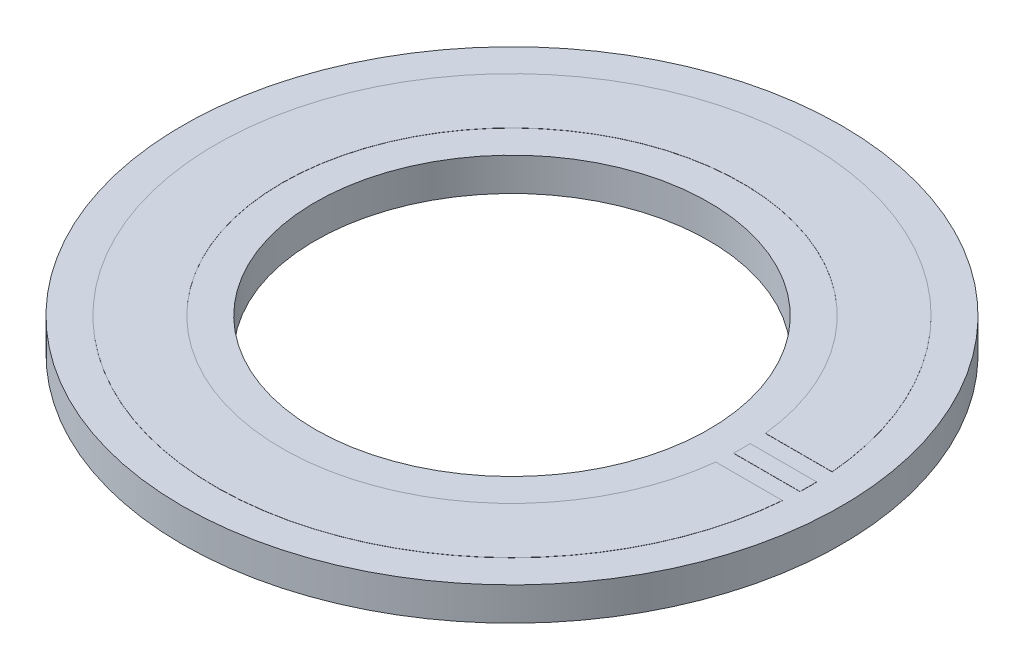
ISO-10303-21;
HEADER;
FILE_DESCRIPTION(('STEP AP214'),'2;1');
FILE_NAME('part.step','',(''),(''),'','','');
FILE_SCHEMA(('AUTOMOTIVE_DESIGN { 1 0 10303 214 1 1 1 1 }'));
ENDSEC;
DATA;
#1=APPLICATION_CONTEXT('core data for automotive mechanical design processes');
#2=APPLICATION_PROTOCOL_DEFINITION('international standard','automotive_design',2000,#1);
#3=PRODUCT_CONTEXT('',#1,'mechanical');
#4=PRODUCT('Part','Part','',(#3));
#5=PRODUCT_RELATED_PRODUCT_CATEGORY('part','',(#4));
#6=PRODUCT_DEFINITION_FORMATION('','',#4);
#7=PRODUCT_DEFINITION_CONTEXT('part definition',#1,'design');
#8=PRODUCT_DEFINITION('design','',#6,#7);
#9=PRODUCT_DEFINITION_SHAPE('','',#8);
#10=(LENGTH_UNIT() NAMED_UNIT(*) SI_UNIT(.MILLI.,.METRE.));
#11=(NAMED_UNIT(*) PLANE_ANGLE_UNIT() SI_UNIT($,.RADIAN.));
#12=(NAMED_UNIT(*) SI_UNIT($,.STERADIAN.) SOLID_ANGLE_UNIT());
#13=UNCERTAINTY_MEASURE_WITH_UNIT(LENGTH_MEASURE(1.E-05),#10,'distance_accuracy_value','');
#14=(GEOMETRIC_REPRESENTATION_CONTEXT(3) GLOBAL_UNCERTAINTY_ASSIGNED_CONTEXT((#13)) GLOBAL_UNIT_ASSIGNED_CONTEXT((#10,
#11,#12)) REPRESENTATION_CONTEXT('',''));
#15=CARTESIAN_POINT('',(0.,0.,0.));
#16=DIRECTION('',(0.,0.,1.));
#17=DIRECTION('',(1.,0.,0.));
#18=AXIS2_PLACEMENT_3D('',#15,#16,#17);
#19=CARTESIAN_POINT('',(0.,28.1,0.));
#20=DIRECTION('',(0.,1.,0.));
#21=DIRECTION('',(0.,0.,1.));
#22=AXIS2_PLACEMENT_3D('',#19,#20,#21);
#23=PLANE('',#22);
#24=CARTESIAN_POINT('',(0.,28.1,0.));
#25=DIRECTION('',(0.,1.,0.));
#26=DIRECTION('',(0.,0.,1.));
#27=AXIS2_PLACEMENT_3D('',#24,#25,#26);
#28=CIRCLE('',#27,19.8582308662777);
#29=CARTESIAN_POINT('',(0.,28.1,19.8582308662777));
#30=VERTEX_POINT('',#29);
#31=EDGE_CURVE('E11',#30,#30,#28,.T.);
#32=ORIENTED_EDGE('',*,*,#31,.T.);
#33=EDGE_LOOP('',(#32));
#34=FACE_BOUND('',#33,.T.);
#35=CARTESIAN_POINT('',(0.,28.1,0.));
#36=DIRECTION('',(0.,1.,0.));
#37=DIRECTION('',(0.,0.,1.));
#38=AXIS2_PLACEMENT_3D('',#35,#36,#37);
#39=CIRCLE('',#38,11.8582308662777);
#40=CARTESIAN_POINT('',(0.,28.1,11.8582308662777));
#41=VERTEX_POINT('',#40);
#42=EDGE_CURVE('E159',#41,#41,#39,.T.);
#43=ORIENTED_EDGE('',*,*,#42,.F.);
#44=EDGE_LOOP('',(#43));
#45=FACE_BOUND('',#44,.T.);
#46=DIRECTION('',(-1.,0.,0.));
#47=VECTOR('',#46,1.);
#48=CARTESIAN_POINT('',(17.8512299204641,28.1,-0.5));
#49=LINE('',#48,#47);
#50=CARTESIAN_POINT('',(17.8512299204641,28.1,-0.5));
#51=VERTEX_POINT('',#50);
#52=CARTESIAN_POINT('',(13.8492080186215,28.1,-0.499999999999999));
#53=VERTEX_POINT('',#52);
#54=EDGE_CURVE('E130',#51,#53,#49,.T.);
#55=ORIENTED_EDGE('',*,*,#54,.F.);
#56=CARTESIAN_POINT('',(0.,28.1,0.));
#57=DIRECTION('',(0.,1.,0.));
#58=DIRECTION('',(0.,0.,1.));
#59=AXIS2_PLACEMENT_3D('',#56,#57,#58);
#60=CIRCLE('',#59,17.8582308662777);
#61=CARTESIAN_POINT('',(17.8512299204641,28.1,0.5));
#62=VERTEX_POINT('',#61);
#63=EDGE_CURVE('E127',#62,#51,#60,.T.);
#64=ORIENTED_EDGE('',*,*,#63,.F.);
#65=DIRECTION('',(1.,0.,0.));
#66=VECTOR('',#65,1.);
#67=CARTESIAN_POINT('',(17.8512299204641,28.1,0.5));
#68=LINE('',#67,#66);
#69=CARTESIAN_POINT('',(13.8492080186215,28.1,0.5));
#70=VERTEX_POINT('',#69);
#71=EDGE_CURVE('E139',#70,#62,#68,.T.);
#72=ORIENTED_EDGE('',*,*,#71,.F.);
#73=CARTESIAN_POINT('',(0.,28.1,0.));
#74=DIRECTION('',(0.,-1.,0.));
#75=DIRECTION('',(0.,0.,1.));
#76=AXIS2_PLACEMENT_3D('',#73,#74,#75);
#77=CIRCLE('',#76,13.8582308662777);
#78=EDGE_CURVE('E147',#53,#70,#77,.T.);
#79=ORIENTED_EDGE('',*,*,#78,.F.);
#80=EDGE_LOOP('',(#55,#64,#72,#79));
#81=FACE_BOUND('',#80,.T.);
#82=DIRECTION('',(-1.,0.,0.));
#83=VECTOR('',#82,1.);
#84=CARTESIAN_POINT('',(17.7951231991597,28.1,1.5));
#85=LINE('',#84,#83);
#86=CARTESIAN_POINT('',(17.7951231991597,28.1,1.5));
#87=VERTEX_POINT('',#86);
#88=CARTESIAN_POINT('',(13.7768125030085,28.1,1.5));
#89=VERTEX_POINT('',#88);
#90=EDGE_CURVE('E196',#87,#89,#85,.T.);
#91=ORIENTED_EDGE('',*,*,#90,.F.);
#92=CARTESIAN_POINT('',(0.,28.1,0.));
#93=DIRECTION('',(0.,1.,0.));
#94=DIRECTION('',(0.,0.,1.));
#95=AXIS2_PLACEMENT_3D('',#92,#93,#94);
#96=CIRCLE('',#95,17.8582308662777);
#97=CARTESIAN_POINT('',(17.7951231991597,28.1,-1.5));
#98=VERTEX_POINT('',#97);
#99=EDGE_CURVE('E125',#98,#87,#96,.T.);
#100=ORIENTED_EDGE('',*,*,#99,.F.);
#101=DIRECTION('',(1.,0.,0.));
#102=VECTOR('',#101,1.);
#103=CARTESIAN_POINT('',(17.7951231991597,28.1,-1.5));
#104=LINE('',#103,#102);
#105=CARTESIAN_POINT('',(13.7768125030085,28.1,-1.5));
#106=VERTEX_POINT('',#105);
#107=EDGE_CURVE('E121',#106,#98,#104,.T.);
#108=ORIENTED_EDGE('',*,*,#107,.F.);
#109=CARTESIAN_POINT('',(0.,28.1,0.));
#110=DIRECTION('',(0.,-1.,0.));
#111=DIRECTION('',(0.,0.,1.));
#112=AXIS2_PLACEMENT_3D('',#109,#110,#111);
#113=CIRCLE('',#112,13.8582308662777);
#114=EDGE_CURVE('E198',#89,#106,#113,.T.);
#115=ORIENTED_EDGE('',*,*,#114,.F.);
#116=EDGE_LOOP('',(#91,#100,#108,#115));
#117=FACE_BOUND('',#116,.T.);
#118=ADVANCED_FACE('F36',(#34,#45,#81,#117),#23,.T.);
#119=CARTESIAN_POINT('',(0.,26.1,0.));
#120=DIRECTION('',(0.,1.,0.));
#121=DIRECTION('',(0.,0.,1.));
#122=AXIS2_PLACEMENT_3D('',#119,#120,#121);
#123=PLANE('',#122);
#124=CARTESIAN_POINT('',(0.,26.1,0.));
#125=DIRECTION('',(0.,1.,0.));
#126=DIRECTION('',(0.,0.,1.));
#127=AXIS2_PLACEMENT_3D('',#124,#125,#126);
#128=CIRCLE('',#127,19.8582308662777);
#129=CARTESIAN_POINT('',(0.,26.1,19.8582308662777));
#130=VERTEX_POINT('',#129);
#131=EDGE_CURVE('E40',#130,#130,#128,.T.);
#132=ORIENTED_EDGE('',*,*,#131,.F.);
#133=EDGE_LOOP('',(#132));
#134=FACE_BOUND('',#133,.T.);
#135=CARTESIAN_POINT('',(0.,26.1,0.));
#136=DIRECTION('',(0.,1.,0.));
#137=DIRECTION('',(0.,0.,1.));
#138=AXIS2_PLACEMENT_3D('',#135,#136,#137);
#139=CIRCLE('',#138,11.8582308662777);
#140=CARTESIAN_POINT('',(0.,26.1,11.8582308662777));
#141=VERTEX_POINT('',#140);
#142=EDGE_CURVE('E158',#141,#141,#139,.T.);
#143=ORIENTED_EDGE('',*,*,#142,.T.);
#144=EDGE_LOOP('',(#143));
#145=FACE_BOUND('',#144,.T.);
#146=ADVANCED_FACE('F165',(#134,#145),#123,.F.);
#147=CARTESIAN_POINT('',(0.,28.1,0.));
#148=DIRECTION('',(0.,-1.,0.));
#149=DIRECTION('',(0.,0.,-1.));
#150=AXIS2_PLACEMENT_3D('',#147,#148,#149);
#151=CYLINDRICAL_SURFACE('',#150,19.8582308662777);
#152=ORIENTED_EDGE('',*,*,#31,.F.);
#153=EDGE_LOOP('',(#152));
#154=FACE_BOUND('',#153,.T.);
#155=ORIENTED_EDGE('',*,*,#131,.T.);
#156=EDGE_LOOP('',(#155));
#157=FACE_BOUND('',#156,.T.);
#158=ADVANCED_FACE('F38',(#154,#157),#151,.T.);
#159=CARTESIAN_POINT('',(0.,28.1,0.));
#160=DIRECTION('',(0.,-1.,0.));
#161=DIRECTION('',(0.,0.,-1.));
#162=AXIS2_PLACEMENT_3D('',#159,#160,#161);
#163=CYLINDRICAL_SURFACE('',#162,11.8582308662777);
#164=ORIENTED_EDGE('',*,*,#42,.T.);
#165=EDGE_LOOP('',(#164));
#166=FACE_BOUND('',#165,.T.);
#167=ORIENTED_EDGE('',*,*,#142,.F.);
#168=EDGE_LOOP('',(#167));
#169=FACE_BOUND('',#168,.T.);
#170=ADVANCED_FACE('F167',(#166,#169),#163,.F.);
#171=CARTESIAN_POINT('',(0.,28.11,0.));
#172=DIRECTION('',(0.,-1.,0.));
#173=DIRECTION('',(0.,0.,-1.));
#174=AXIS2_PLACEMENT_3D('',#171,#172,#173);
#175=CYLINDRICAL_SURFACE('',#174,17.8582308662777);
#176=ORIENTED_EDGE('',*,*,#63,.T.);
#177=DIRECTION('',(0.,-1.,0.));
#178=VECTOR('',#177,1.);
#179=CARTESIAN_POINT('',(17.8512299204641,28.11,-0.5));
#180=LINE('',#179,#178);
#181=CARTESIAN_POINT('',(17.8512299204641,28.11,-0.5));
#182=VERTEX_POINT('',#181);
#183=EDGE_CURVE('E156',#182,#51,#180,.T.);
#184=ORIENTED_EDGE('',*,*,#183,.F.);
#185=CARTESIAN_POINT('',(0.,28.11,0.));
#186=DIRECTION('',(0.,1.,0.));
#187=DIRECTION('',(0.,0.,1.));
#188=AXIS2_PLACEMENT_3D('',#185,#186,#187);
#189=CIRCLE('',#188,17.8582308662777);
#190=CARTESIAN_POINT('',(17.8512299204641,28.11,0.5));
#191=VERTEX_POINT('',#190);
#192=EDGE_CURVE('E135',#191,#182,#189,.T.);
#193=ORIENTED_EDGE('',*,*,#192,.F.);
#194=DIRECTION('',(0.,-1.,0.));
#195=VECTOR('',#194,1.);
#196=CARTESIAN_POINT('',(17.8512299204641,28.11,0.5));
#197=LINE('',#196,#195);
#198=EDGE_CURVE('E144',#191,#62,#197,.T.);
#199=ORIENTED_EDGE('',*,*,#198,.T.);
#200=EDGE_LOOP('',(#176,#184,#193,#199));
#201=FACE_BOUND('',#200,.T.);
#202=ADVANCED_FACE('F169',(#201),#175,.T.);
#203=CARTESIAN_POINT('',(17.8512299204641,28.11,-0.5));
#204=DIRECTION('',(0.,0.,1.));
#205=DIRECTION('',(1.,0.,0.));
#206=AXIS2_PLACEMENT_3D('',#203,#204,#205);
#207=PLANE('',#206);
#208=ORIENTED_EDGE('',*,*,#54,.T.);
#209=DIRECTION('',(0.,-1.,0.));
#210=VECTOR('',#209,1.);
#211=CARTESIAN_POINT('',(13.8492080186215,28.11,-0.499999999999999));
#212=LINE('',#211,#210);
#213=CARTESIAN_POINT('',(13.8492080186215,28.11,-0.499999999999999));
#214=VERTEX_POINT('',#213);
#215=EDGE_CURVE('E153',#214,#53,#212,.T.);
#216=ORIENTED_EDGE('',*,*,#215,.F.);
#217=DIRECTION('',(-1.,0.,0.));
#218=VECTOR('',#217,1.);
#219=CARTESIAN_POINT('',(17.8512299204641,28.11,-0.5));
#220=LINE('',#219,#218);
#221=EDGE_CURVE('E138',#182,#214,#220,.T.);
#222=ORIENTED_EDGE('',*,*,#221,.F.);
#223=ORIENTED_EDGE('',*,*,#183,.T.);
#224=EDGE_LOOP('',(#208,#216,#222,#223));
#225=FACE_BOUND('',#224,.T.);
#226=ADVANCED_FACE('F176',(#225),#207,.F.);
#227=CARTESIAN_POINT('',(0.,28.11,0.));
#228=DIRECTION('',(0.,-1.,0.));
#229=DIRECTION('',(0.,0.,-1.));
#230=AXIS2_PLACEMENT_3D('',#227,#228,#229);
#231=CYLINDRICAL_SURFACE('',#230,13.8582308662777);
#232=ORIENTED_EDGE('',*,*,#78,.T.);
#233=DIRECTION('',(0.,-1.,0.));
#234=VECTOR('',#233,1.);
#235=CARTESIAN_POINT('',(13.8492080186215,28.11,0.5));
#236=LINE('',#235,#234);
#237=CARTESIAN_POINT('',(13.8492080186215,28.11,0.5));
#238=VERTEX_POINT('',#237);
#239=EDGE_CURVE('E59',#238,#70,#236,.T.);
#240=ORIENTED_EDGE('',*,*,#239,.F.);
#241=CARTESIAN_POINT('',(0.,28.11,0.));
#242=DIRECTION('',(0.,-1.,0.));
#243=DIRECTION('',(0.,0.,1.));
#244=AXIS2_PLACEMENT_3D('',#241,#242,#243);
#245=CIRCLE('',#244,13.8582308662777);
#246=EDGE_CURVE('E141',#214,#238,#245,.T.);
#247=ORIENTED_EDGE('',*,*,#246,.F.);
#248=ORIENTED_EDGE('',*,*,#215,.T.);
#249=EDGE_LOOP('',(#232,#240,#247,#248));
#250=FACE_BOUND('',#249,.T.);
#251=ADVANCED_FACE('F230',(#250),#231,.F.);
#252=CARTESIAN_POINT('',(17.8512299204641,28.11,0.5));
#253=DIRECTION('',(0.,0.,-1.));
#254=DIRECTION('',(-1.,0.,0.));
#255=AXIS2_PLACEMENT_3D('',#252,#253,#254);
#256=PLANE('',#255);
#257=ORIENTED_EDGE('',*,*,#71,.T.);
#258=ORIENTED_EDGE('',*,*,#198,.F.);
#259=DIRECTION('',(1.,0.,0.));
#260=VECTOR('',#259,1.);
#261=CARTESIAN_POINT('',(17.8512299204641,28.11,0.5));
#262=LINE('',#261,#260);
#263=EDGE_CURVE('E143',#238,#191,#262,.T.);
#264=ORIENTED_EDGE('',*,*,#263,.F.);
#265=ORIENTED_EDGE('',*,*,#239,.T.);
#266=EDGE_LOOP('',(#257,#258,#264,#265));
#267=FACE_BOUND('',#266,.T.);
#268=ADVANCED_FACE('F226',(#267),#256,.F.);
#269=CARTESIAN_POINT('',(0.,28.11,0.));
#270=DIRECTION('',(0.,1.,0.));
#271=DIRECTION('',(0.,0.,1.));
#272=AXIS2_PLACEMENT_3D('',#269,#270,#271);
#273=PLANE('',#272);
#274=ORIENTED_EDGE('',*,*,#192,.T.);
#275=ORIENTED_EDGE('',*,*,#221,.T.);
#276=ORIENTED_EDGE('',*,*,#246,.T.);
#277=ORIENTED_EDGE('',*,*,#263,.T.);
#278=EDGE_LOOP('',(#274,#275,#276,#277));
#279=FACE_BOUND('',#278,.T.);
#280=ADVANCED_FACE('F223',(#279),#273,.T.);
#281=CARTESIAN_POINT('',(0.,28.11,0.));
#282=DIRECTION('',(0.,-1.,0.));
#283=DIRECTION('',(0.,0.,-1.));
#284=AXIS2_PLACEMENT_3D('',#281,#282,#283);
#285=CYLINDRICAL_SURFACE('',#284,17.8582308662777);
#286=ORIENTED_EDGE('',*,*,#99,.T.);
#287=DIRECTION('',(0.,-1.,0.));
#288=VECTOR('',#287,1.);
#289=CARTESIAN_POINT('',(17.7951231991597,28.11,1.5));
#290=LINE('',#289,#288);
#291=CARTESIAN_POINT('',(17.7951231991597,28.11,1.5));
#292=VERTEX_POINT('',#291);
#293=EDGE_CURVE('E106',#292,#87,#290,.T.);
#294=ORIENTED_EDGE('',*,*,#293,.F.);
#295=CARTESIAN_POINT('',(0.,28.11,0.));
#296=DIRECTION('',(0.,1.,0.));
#297=DIRECTION('',(0.,0.,1.));
#298=AXIS2_PLACEMENT_3D('',#295,#296,#297);
#299=CIRCLE('',#298,17.8582308662777);
#300=CARTESIAN_POINT('',(17.7951231991597,28.11,-1.5));
#301=VERTEX_POINT('',#300);
#302=EDGE_CURVE('E113',#301,#292,#299,.T.);
#303=ORIENTED_EDGE('',*,*,#302,.F.);
#304=DIRECTION('',(0.,-1.,0.));
#305=VECTOR('',#304,1.);
#306=CARTESIAN_POINT('',(17.7951231991597,28.11,-1.5));
#307=LINE('',#306,#305);
#308=EDGE_CURVE('E205',#301,#98,#307,.T.);
#309=ORIENTED_EDGE('',*,*,#308,.T.);
#310=EDGE_LOOP('',(#286,#294,#303,#309));
#311=FACE_BOUND('',#310,.T.);
#312=ADVANCED_FACE('F123',(#311),#285,.T.);
#313=CARTESIAN_POINT('',(17.7951231991597,28.11,1.5));
#314=DIRECTION('',(0.,0.,1.));
#315=DIRECTION('',(1.,0.,0.));
#316=AXIS2_PLACEMENT_3D('',#313,#314,#315);
#317=PLANE('',#316);
#318=ORIENTED_EDGE('',*,*,#90,.T.);
#319=DIRECTION('',(0.,-1.,0.));
#320=VECTOR('',#319,1.);
#321=CARTESIAN_POINT('',(13.7768125030085,28.11,1.5));
#322=LINE('',#321,#320);
#323=CARTESIAN_POINT('',(13.7768125030085,28.11,1.5));
#324=VERTEX_POINT('',#323);
#325=EDGE_CURVE('E109',#324,#89,#322,.T.);
#326=ORIENTED_EDGE('',*,*,#325,.F.);
#327=DIRECTION('',(-1.,0.,0.));
#328=VECTOR('',#327,1.);
#329=CARTESIAN_POINT('',(17.7951231991597,28.11,1.5));
#330=LINE('',#329,#328);
#331=EDGE_CURVE('E102',#292,#324,#330,.T.);
#332=ORIENTED_EDGE('',*,*,#331,.F.);
#333=ORIENTED_EDGE('',*,*,#293,.T.);
#334=EDGE_LOOP('',(#318,#326,#332,#333));
#335=FACE_BOUND('',#334,.T.);
#336=ADVANCED_FACE('F104',(#335),#317,.F.);
#337=CARTESIAN_POINT('',(0.,28.11,0.));
#338=DIRECTION('',(0.,-1.,0.));
#339=DIRECTION('',(0.,0.,-1.));
#340=AXIS2_PLACEMENT_3D('',#337,#338,#339);
#341=CYLINDRICAL_SURFACE('',#340,13.8582308662777);
#342=ORIENTED_EDGE('',*,*,#114,.T.);
#343=DIRECTION('',(0.,-1.,0.));
#344=VECTOR('',#343,1.);
#345=CARTESIAN_POINT('',(13.7768125030085,28.11,-1.5));
#346=LINE('',#345,#344);
#347=CARTESIAN_POINT('',(13.7768125030085,28.11,-1.5));
#348=VERTEX_POINT('',#347);
#349=EDGE_CURVE('E51',#348,#106,#346,.T.);
#350=ORIENTED_EDGE('',*,*,#349,.F.);
#351=CARTESIAN_POINT('',(0.,28.11,0.));
#352=DIRECTION('',(0.,-1.,0.));
#353=DIRECTION('',(0.,0.,1.));
#354=AXIS2_PLACEMENT_3D('',#351,#352,#353);
#355=CIRCLE('',#354,13.8582308662777);
#356=EDGE_CURVE('E112',#324,#348,#355,.T.);
#357=ORIENTED_EDGE('',*,*,#356,.F.);
#358=ORIENTED_EDGE('',*,*,#325,.T.);
#359=EDGE_LOOP('',(#342,#350,#357,#358));
#360=FACE_BOUND('',#359,.T.);
#361=ADVANCED_FACE('F208',(#360),#341,.F.);
#362=CARTESIAN_POINT('',(17.7951231991597,28.11,-1.5));
#363=DIRECTION('',(0.,0.,-1.));
#364=DIRECTION('',(-1.,0.,0.));
#365=AXIS2_PLACEMENT_3D('',#362,#363,#364);
#366=PLANE('',#365);
#367=ORIENTED_EDGE('',*,*,#107,.T.);
#368=ORIENTED_EDGE('',*,*,#308,.F.);
#369=DIRECTION('',(1.,0.,0.));
#370=VECTOR('',#369,1.);
#371=CARTESIAN_POINT('',(17.7951231991597,28.11,-1.5));
#372=LINE('',#371,#370);
#373=EDGE_CURVE('E117',#348,#301,#372,.T.);
#374=ORIENTED_EDGE('',*,*,#373,.F.);
#375=ORIENTED_EDGE('',*,*,#349,.T.);
#376=EDGE_LOOP('',(#367,#368,#374,#375));
#377=FACE_BOUND('',#376,.T.);
#378=ADVANCED_FACE('F209',(#377),#366,.F.);
#379=CARTESIAN_POINT('',(0.,28.11,0.));
#380=DIRECTION('',(0.,1.,0.));
#381=DIRECTION('',(0.,0.,1.));
#382=AXIS2_PLACEMENT_3D('',#379,#380,#381);
#383=PLANE('',#382);
#384=ORIENTED_EDGE('',*,*,#302,.T.);
#385=ORIENTED_EDGE('',*,*,#331,.T.);
#386=ORIENTED_EDGE('',*,*,#356,.T.);
#387=ORIENTED_EDGE('',*,*,#373,.T.);
#388=EDGE_LOOP('',(#384,#385,#386,#387));
#389=FACE_BOUND('',#388,.T.);
#390=ADVANCED_FACE('F116',(#389),#383,.T.);
#391=CLOSED_SHELL('',(#118,#146,#158,#170,#202,#226,#251,#268,#280,#312,#336,#361,#378,#390));
#392=MANIFOLD_SOLID_BREP('B2',#391);
#393=ADVANCED_BREP_SHAPE_REPRESENTATION('',(#18,#392),#14);
#394=SHAPE_DEFINITION_REPRESENTATION(#9,#393);
ENDSEC;
END-ISO-10303-21;
